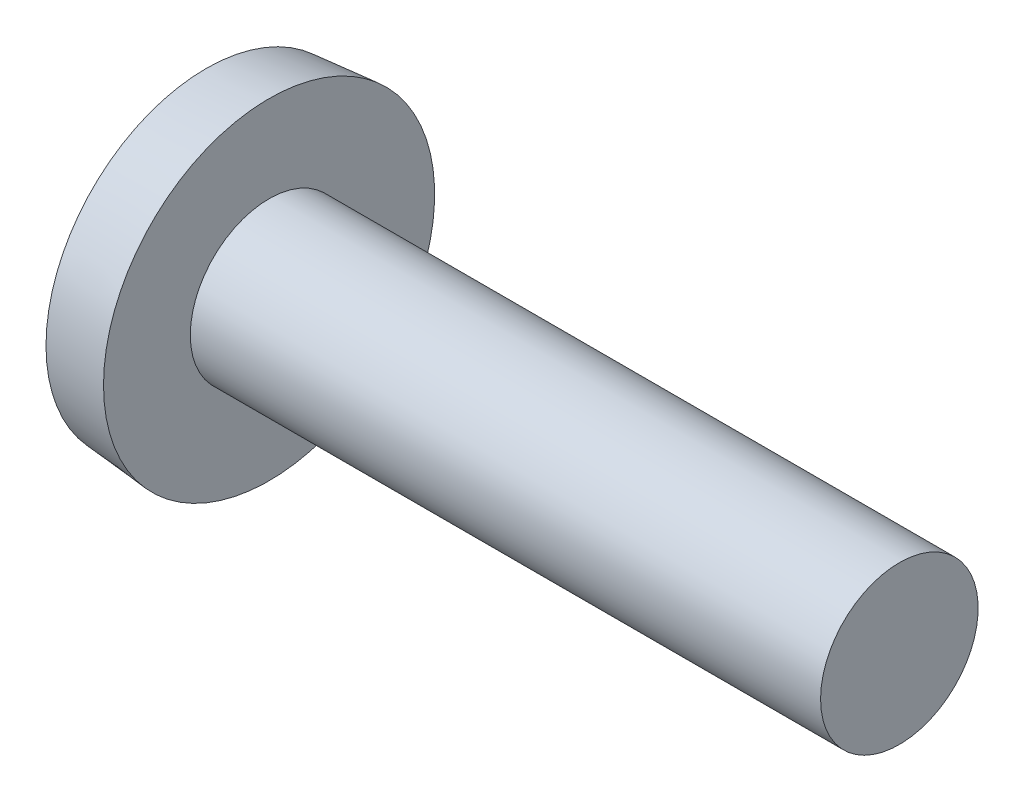
ISO-10303-21;
HEADER;
FILE_DESCRIPTION(('STEP AP214'),'2;1');
FILE_NAME('part.step','',(''),(''),'','','');
FILE_SCHEMA(('AUTOMOTIVE_DESIGN { 1 0 10303 214 1 1 1 1 }'));
ENDSEC;
DATA;
#1=APPLICATION_CONTEXT('core data for automotive mechanical design processes');
#2=APPLICATION_PROTOCOL_DEFINITION('international standard','automotive_design',2000,#1);
#3=PRODUCT_CONTEXT('',#1,'mechanical');
#4=PRODUCT('Part','Part','',(#3));
#5=PRODUCT_RELATED_PRODUCT_CATEGORY('part','',(#4));
#6=PRODUCT_DEFINITION_FORMATION('','',#4);
#7=PRODUCT_DEFINITION_CONTEXT('part definition',#1,'design');
#8=PRODUCT_DEFINITION('design','',#6,#7);
#9=PRODUCT_DEFINITION_SHAPE('','',#8);
#10=(LENGTH_UNIT() NAMED_UNIT(*) SI_UNIT(.MILLI.,.METRE.));
#11=(NAMED_UNIT(*) PLANE_ANGLE_UNIT() SI_UNIT($,.RADIAN.));
#12=(NAMED_UNIT(*) SI_UNIT($,.STERADIAN.) SOLID_ANGLE_UNIT());
#13=UNCERTAINTY_MEASURE_WITH_UNIT(LENGTH_MEASURE(1.E-05),#10,'distance_accuracy_value','');
#14=(GEOMETRIC_REPRESENTATION_CONTEXT(3) GLOBAL_UNCERTAINTY_ASSIGNED_CONTEXT((#13)) GLOBAL_UNIT_ASSIGNED_CONTEXT((#10,
#11,#12)) REPRESENTATION_CONTEXT('',''));
#15=CARTESIAN_POINT('',(0.,0.,0.));
#16=DIRECTION('',(0.,0.,1.));
#17=DIRECTION('',(1.,0.,0.));
#18=AXIS2_PLACEMENT_3D('',#15,#16,#17);
#19=CARTESIAN_POINT('',(20.7932858958974,0.,0.));
#20=DIRECTION('',(-1.,0.,0.));
#21=DIRECTION('',(0.,1.,0.));
#22=AXIS2_PLACEMENT_3D('',#19,#20,#21);
#23=SPHERICAL_SURFACE('',#22,20.7932858958974);
#24=CARTESIAN_POINT('',(10.7968001713112,0.,-7.77883530786916));
#25=DIRECTION('',(0.789207158591942,0.,0.61412707221489));
#26=DIRECTION('',(0.61412707221489,0.,-0.789207158591942));
#27=AXIS2_PLACEMENT_3D('',#24,#25,#26);
#28=CIRCLE('',#27,16.4900191861537);
#29=CARTESIAN_POINT('',(0.683324258951215,0.850899999999998,5.21786838652322));
#30=VERTEX_POINT('',#29);
#31=CARTESIAN_POINT('',(0.686560417440004,0.94739679267156,5.21370963899157));
#32=VERTEX_POINT('',#31);
#33=EDGE_CURVE('E381',#30,#32,#28,.F.);
#34=ORIENTED_EDGE('',*,*,#33,.F.);
#35=CARTESIAN_POINT('',(20.7932858958974,0.850899999999999,0.));
#36=DIRECTION('',(0.,-1.,0.));
#37=DIRECTION('',(0.,0.,-1.));
#38=AXIS2_PLACEMENT_3D('',#35,#36,#37);
#39=CIRCLE('',#38,20.7758683943301);
#40=CARTESIAN_POINT('',(2.2606,0.850899999999998,9.39022156408098));
#41=VERTEX_POINT('',#40);
#42=EDGE_CURVE('E274',#30,#41,#39,.F.);
#43=ORIENTED_EDGE('',*,*,#42,.T.);
#44=CARTESIAN_POINT('',(2.2606,0.,0.));
#45=DIRECTION('',(-1.,0.,0.));
#46=DIRECTION('',(0.,0.,1.));
#47=AXIS2_PLACEMENT_3D('',#44,#45,#46);
#48=CIRCLE('',#47,9.42869512883577);
#49=CARTESIAN_POINT('',(2.2606,-0.8509,9.39022156408098));
#50=VERTEX_POINT('',#49);
#51=EDGE_CURVE('E271',#41,#50,#48,.F.);
#52=ORIENTED_EDGE('',*,*,#51,.T.);
#53=CARTESIAN_POINT('',(20.7932858958974,-0.8509,0.));
#54=DIRECTION('',(0.,1.,0.));
#55=DIRECTION('',(0.,0.,1.));
#56=AXIS2_PLACEMENT_3D('',#53,#54,#55);
#57=CIRCLE('',#56,20.7758683943301);
#58=CARTESIAN_POINT('',(0.683324258951215,-0.8509,5.21786838652322));
#59=VERTEX_POINT('',#58);
#60=EDGE_CURVE('E280',#50,#59,#57,.F.);
#61=ORIENTED_EDGE('',*,*,#60,.T.);
#62=CARTESIAN_POINT('',(0.68656041744,-0.947396792671597,5.21370963899156));
#63=VERTEX_POINT('',#62);
#64=EDGE_CURVE('E384',#63,#59,#28,.F.);
#65=ORIENTED_EDGE('',*,*,#64,.F.);
#66=CARTESIAN_POINT('',(20.6258579707535,1.41383581232608,0.));
#67=DIRECTION('',(-0.117599343536163,0.993061123194269,0.));
#68=DIRECTION('',(-0.993061123194269,-0.117599343536163,0.));
#69=AXIS2_PLACEMENT_3D('',#66,#67,#68);
#70=CIRCLE('',#69,20.7444878108425);
#71=CARTESIAN_POINT('',(0.0503651349985992,-1.02273570769754,1.02273570769753));
#72=VERTEX_POINT('',#71);
#73=EDGE_CURVE('E367',#63,#72,#70,.F.);
#74=ORIENTED_EDGE('',*,*,#73,.T.);
#75=CARTESIAN_POINT('',(20.6258579707535,0.,-1.41383581232608));
#76=DIRECTION('',(-0.117599343536163,0.,-0.993061123194269));
#77=DIRECTION('',(-0.993061123194269,0.,0.117599343536163));
#78=AXIS2_PLACEMENT_3D('',#75,#76,#77);
#79=CIRCLE('',#78,20.7444878108425);
#80=CARTESIAN_POINT('',(0.686560417440005,-5.21370963899157,0.947396792671578));
#81=VERTEX_POINT('',#80);
#82=EDGE_CURVE('E242',#72,#81,#79,.F.);
#83=ORIENTED_EDGE('',*,*,#82,.T.);
#84=CARTESIAN_POINT('',(10.7968001713112,7.77883530786916,0.));
#85=DIRECTION('',(0.789207158591942,-0.61412707221489,0.));
#86=DIRECTION('',(0.61412707221489,0.789207158591942,0.));
#87=AXIS2_PLACEMENT_3D('',#84,#85,#86);
#88=CIRCLE('',#87,16.4900191861537);
#89=CARTESIAN_POINT('',(0.686560417440005,-5.21370963899157,-0.947396792671579));
#90=VERTEX_POINT('',#89);
#91=EDGE_CURVE('E290',#90,#81,#88,.F.);
#92=ORIENTED_EDGE('',*,*,#91,.F.);
#93=CARTESIAN_POINT('',(20.6258579707535,0.,1.41383581232608));
#94=DIRECTION('',(-0.117599343536164,0.,0.993061123194269));
#95=DIRECTION('',(0.993061123194269,0.,0.117599343536164));
#96=AXIS2_PLACEMENT_3D('',#93,#94,#95);
#97=CIRCLE('',#96,20.7444878108425);
#98=CARTESIAN_POINT('',(0.0503651349985992,-1.02273570769753,-1.02273570769753));
#99=VERTEX_POINT('',#98);
#100=EDGE_CURVE('E250',#90,#99,#97,.F.);
#101=ORIENTED_EDGE('',*,*,#100,.T.);
#102=CARTESIAN_POINT('',(0.686560417440005,-0.94739679267156,-5.21370963899158));
#103=VERTEX_POINT('',#102);
#104=EDGE_CURVE('E47',#99,#103,#70,.F.);
#105=ORIENTED_EDGE('',*,*,#104,.T.);
#106=CARTESIAN_POINT('',(10.7968001713112,0.,7.77883530786916));
#107=DIRECTION('',(0.789207158591942,0.,-0.61412707221489));
#108=DIRECTION('',(-0.61412707221489,0.,-0.789207158591942));
#109=AXIS2_PLACEMENT_3D('',#106,#107,#108);
#110=CIRCLE('',#109,16.4900191861537);
#111=CARTESIAN_POINT('',(0.683324258951215,-0.8509,-5.21786838652322));
#112=VERTEX_POINT('',#111);
#113=EDGE_CURVE('E357',#112,#103,#110,.F.);
#114=ORIENTED_EDGE('',*,*,#113,.F.);
#115=CARTESIAN_POINT('',(2.2606,-0.8509,-9.39022156408098));
#116=VERTEX_POINT('',#115);
#117=EDGE_CURVE('E279',#112,#116,#57,.F.);
#118=ORIENTED_EDGE('',*,*,#117,.T.);
#119=CARTESIAN_POINT('',(2.2606,0.8509,-9.39022156408098));
#120=VERTEX_POINT('',#119);
#121=EDGE_CURVE('E275',#116,#120,#48,.F.);
#122=ORIENTED_EDGE('',*,*,#121,.T.);
#123=CARTESIAN_POINT('',(0.683324258951217,0.850899999999999,-5.21786838652322));
#124=VERTEX_POINT('',#123);
#125=EDGE_CURVE('E276',#120,#124,#39,.F.);
#126=ORIENTED_EDGE('',*,*,#125,.T.);
#127=CARTESIAN_POINT('',(0.686560417440005,0.947396792671598,-5.21370963899157));
#128=VERTEX_POINT('',#127);
#129=EDGE_CURVE('E363',#128,#124,#110,.F.);
#130=ORIENTED_EDGE('',*,*,#129,.F.);
#131=CARTESIAN_POINT('',(20.6258579707535,-1.41383581232608,0.));
#132=DIRECTION('',(-0.117599343536164,-0.993061123194269,0.));
#133=DIRECTION('',(0.993061123194269,-0.117599343536164,0.));
#134=AXIS2_PLACEMENT_3D('',#131,#132,#133);
#135=CIRCLE('',#134,20.7444878108425);
#136=CARTESIAN_POINT('',(0.0503651349985958,1.02273570769754,-1.02273570769753));
#137=VERTEX_POINT('',#136);
#138=EDGE_CURVE('E228',#128,#137,#135,.F.);
#139=ORIENTED_EDGE('',*,*,#138,.T.);
#140=CARTESIAN_POINT('',(0.68656041744,5.21370963899157,-0.947396792671578));
#141=VERTEX_POINT('',#140);
#142=EDGE_CURVE('E248',#137,#141,#97,.F.);
#143=ORIENTED_EDGE('',*,*,#142,.T.);
#144=CARTESIAN_POINT('',(10.7968001713112,-7.77883530786916,0.));
#145=DIRECTION('',(0.789207158591942,0.61412707221489,0.));
#146=DIRECTION('',(-0.61412707221489,0.789207158591942,0.));
#147=AXIS2_PLACEMENT_3D('',#144,#145,#146);
#148=CIRCLE('',#147,16.4900191861537);
#149=CARTESIAN_POINT('',(0.686560417440004,5.21370963899156,0.947396792671578));
#150=VERTEX_POINT('',#149);
#151=EDGE_CURVE('E292',#150,#141,#148,.F.);
#152=ORIENTED_EDGE('',*,*,#151,.F.);
#153=CARTESIAN_POINT('',(0.0503651349986027,1.02273570769753,1.02273570769753));
#154=VERTEX_POINT('',#153);
#155=EDGE_CURVE('E208',#150,#154,#79,.F.);
#156=ORIENTED_EDGE('',*,*,#155,.T.);
#157=EDGE_CURVE('E232',#154,#32,#135,.F.);
#158=ORIENTED_EDGE('',*,*,#157,.T.);
#159=EDGE_LOOP('',(#34,#43,#52,#61,#65,#74,#83,#92,#101,#105,#114,#118,#122,#126,#130,#139,#143,
#152,#156,#158));
#160=FACE_BOUND('',#159,.T.);
#161=CARTESIAN_POINT('',(2.3876,0.,0.));
#162=DIRECTION('',(-1.,0.,0.));
#163=DIRECTION('',(0.,0.,1.));
#164=AXIS2_PLACEMENT_3D('',#161,#162,#163);
#165=CIRCLE('',#164,9.67426819196622);
#166=CARTESIAN_POINT('',(2.3876,0.,9.67426819196622));
#167=VERTEX_POINT('',#166);
#168=EDGE_CURVE('E265',#167,#167,#165,.T.);
#169=ORIENTED_EDGE('',*,*,#168,.T.);
#170=EDGE_LOOP('',(#169));
#171=FACE_BOUND('',#170,.T.);
#172=ADVANCED_FACE('F32',(#160,#171),#23,.T.);
#173=CARTESIAN_POINT('',(2.2606,-0.8509,10.0076));
#174=DIRECTION('',(0.,1.,0.));
#175=DIRECTION('',(0.,0.,1.));
#176=AXIS2_PLACEMENT_3D('',#173,#174,#175);
#177=PLANE('',#176);
#178=DIRECTION('',(-0.61412707221489,0.,-0.789207158591942));
#179=VECTOR('',#178,1.);
#180=CARTESIAN_POINT('',(8.65757782824143,-0.8509,5.02974694594183));
#181=LINE('',#180,#179);
#182=CARTESIAN_POINT('',(1.50142222222212,-0.850899999999999,-4.16654074074087));
#183=VERTEX_POINT('',#182);
#184=EDGE_CURVE('E361',#183,#112,#181,.T.);
#185=ORIENTED_EDGE('',*,*,#184,.F.);
#186=DIRECTION('',(0.,0.,1.));
#187=VECTOR('',#186,1.);
#188=CARTESIAN_POINT('',(1.50142222222252,-0.8509,10.0076));
#189=LINE('',#188,#187);
#190=CARTESIAN_POINT('',(1.50142222222221,-0.850899999999999,-0.850900000000001));
#191=VERTEX_POINT('',#190);
#192=EDGE_CURVE('E374',#183,#191,#189,.T.);
#193=ORIENTED_EDGE('',*,*,#192,.T.);
#194=DIRECTION('',(0.993061123194269,0.,0.117599343536164));
#195=VECTOR('',#194,1.);
#196=CARTESIAN_POINT('',(3.51819272665187,-0.8509,-0.61207191394912));
#197=LINE('',#196,#195);
#198=CARTESIAN_POINT('',(2.2606,-0.8509,-0.760997368421053));
#199=VERTEX_POINT('',#198);
#200=EDGE_CURVE('E246',#191,#199,#197,.T.);
#201=ORIENTED_EDGE('',*,*,#200,.T.);
#202=DIRECTION('',(0.,0.,-1.));
#203=VECTOR('',#202,1.);
#204=CARTESIAN_POINT('',(2.2606,-0.8509,10.0076));
#205=LINE('',#204,#203);
#206=EDGE_CURVE('E255',#199,#116,#205,.T.);
#207=ORIENTED_EDGE('',*,*,#206,.T.);
#208=ORIENTED_EDGE('',*,*,#117,.F.);
#209=EDGE_LOOP('',(#185,#193,#201,#207,#208));
#210=FACE_BOUND('',#209,.T.);
#211=ADVANCED_FACE('F432',(#210),#177,.T.);
#212=CARTESIAN_POINT('',(2.2606,0.8509,-10.0076));
#213=DIRECTION('',(0.,-1.,0.));
#214=DIRECTION('',(0.,0.,-1.));
#215=AXIS2_PLACEMENT_3D('',#212,#213,#214);
#216=PLANE('',#215);
#217=DIRECTION('',(-0.993061123194269,0.,-0.117599343536164));
#218=VECTOR('',#217,1.);
#219=CARTESIAN_POINT('',(1.18075089636332,0.850899999999999,-0.888874235956976));
#220=LINE('',#219,#218);
#221=CARTESIAN_POINT('',(2.2606,0.8509,-0.760997368421053));
#222=VERTEX_POINT('',#221);
#223=CARTESIAN_POINT('',(1.50142222222226,0.850899999999999,-0.850899999999996));
#224=VERTEX_POINT('',#223);
#225=EDGE_CURVE('E243',#222,#224,#220,.T.);
#226=ORIENTED_EDGE('',*,*,#225,.T.);
#227=DIRECTION('',(0.,0.,-1.));
#228=VECTOR('',#227,1.);
#229=CARTESIAN_POINT('',(1.50142222222253,0.8509,-10.0076));
#230=LINE('',#229,#228);
#231=CARTESIAN_POINT('',(1.50142222222237,0.850899999999999,-4.16654074074055));
#232=VERTEX_POINT('',#231);
#233=EDGE_CURVE('E55',#224,#232,#230,.T.);
#234=ORIENTED_EDGE('',*,*,#233,.T.);
#235=DIRECTION('',(0.61412707221489,0.,0.789207158591942));
#236=VECTOR('',#235,1.);
#237=CARTESIAN_POINT('',(-1.04325884222211,0.8509,-7.43667912618894));
#238=LINE('',#237,#236);
#239=EDGE_CURVE('E395',#124,#232,#238,.T.);
#240=ORIENTED_EDGE('',*,*,#239,.F.);
#241=ORIENTED_EDGE('',*,*,#125,.F.);
#242=DIRECTION('',(0.,0.,1.));
#243=VECTOR('',#242,1.);
#244=CARTESIAN_POINT('',(2.2606,0.8509,-10.0076));
#245=LINE('',#244,#243);
#246=EDGE_CURVE('E256',#120,#222,#245,.T.);
#247=ORIENTED_EDGE('',*,*,#246,.T.);
#248=EDGE_LOOP('',(#226,#234,#240,#241,#247));
#249=FACE_BOUND('',#248,.T.);
#250=ADVANCED_FACE('F394',(#249),#216,.T.);
#251=CARTESIAN_POINT('',(2.2606,-0.8509,10.0076));
#252=DIRECTION('',(-1.,0.,0.));
#253=DIRECTION('',(0.,0.,1.));
#254=AXIS2_PLACEMENT_3D('',#251,#252,#253);
#255=PLANE('',#254);
#256=DIRECTION('',(0.,-1.,0.));
#257=VECTOR('',#256,1.);
#258=CARTESIAN_POINT('',(2.2606,-0.850899999999953,-3.19093070175439));
#259=LINE('',#258,#257);
#260=CARTESIAN_POINT('',(2.2606,0.760997368421064,-3.19093070175438));
#261=VERTEX_POINT('',#260);
#262=CARTESIAN_POINT('',(2.2606,-0.760997368421041,-3.19093070175439));
#263=VERTEX_POINT('',#262);
#264=EDGE_CURVE('E326',#261,#263,#259,.T.);
#265=ORIENTED_EDGE('',*,*,#264,.F.);
#266=DIRECTION('',(0.,0.,1.));
#267=VECTOR('',#266,1.);
#268=CARTESIAN_POINT('',(2.2606,0.760997368421017,10.0076));
#269=LINE('',#268,#267);
#270=CARTESIAN_POINT('',(2.2606,0.760997368421055,-0.760997368421053));
#271=VERTEX_POINT('',#270);
#272=EDGE_CURVE('E389',#261,#271,#269,.T.);
#273=ORIENTED_EDGE('',*,*,#272,.T.);
#274=DIRECTION('',(0.,1.,0.));
#275=VECTOR('',#274,1.);
#276=CARTESIAN_POINT('',(2.2606,-0.850899999999999,-0.760997368421053));
#277=LINE('',#276,#275);
#278=EDGE_CURVE('E285',#271,#222,#277,.T.);
#279=ORIENTED_EDGE('',*,*,#278,.T.);
#280=ORIENTED_EDGE('',*,*,#246,.F.);
#281=ORIENTED_EDGE('',*,*,#121,.F.);
#282=ORIENTED_EDGE('',*,*,#206,.F.);
#283=CARTESIAN_POINT('',(2.2606,-0.76099736842105,-0.760997368421053));
#284=VERTEX_POINT('',#283);
#285=EDGE_CURVE('E287',#199,#284,#277,.T.);
#286=ORIENTED_EDGE('',*,*,#285,.T.);
#287=DIRECTION('',(0.,0.,-1.));
#288=VECTOR('',#287,1.);
#289=CARTESIAN_POINT('',(2.2606,-0.760997368421088,10.0076));
#290=LINE('',#289,#288);
#291=EDGE_CURVE('E334',#284,#263,#290,.T.);
#292=ORIENTED_EDGE('',*,*,#291,.T.);
#293=EDGE_LOOP('',(#265,#273,#279,#280,#281,#282,#286,#292));
#294=FACE_BOUND('',#293,.T.);
#295=ADVANCED_FACE('F397',(#294),#255,.T.);
#296=DIRECTION('',(0.,-1.,0.));
#297=VECTOR('',#296,1.);
#298=CARTESIAN_POINT('',(2.2606,-0.8509,0.760997368421052));
#299=LINE('',#298,#297);
#300=CARTESIAN_POINT('',(2.2606,0.8509,0.760997368421052));
#301=VERTEX_POINT('',#300);
#302=CARTESIAN_POINT('',(2.2606,0.76099736842105,0.760997368421052));
#303=VERTEX_POINT('',#302);
#304=EDGE_CURVE('E283',#301,#303,#299,.T.);
#305=ORIENTED_EDGE('',*,*,#304,.T.);
#306=DIRECTION('',(0.,0.,1.));
#307=VECTOR('',#306,1.);
#308=CARTESIAN_POINT('',(2.2606,0.760997368421017,10.0076));
#309=LINE('',#308,#307);
#310=CARTESIAN_POINT('',(2.2606,0.760997368421041,3.19093070175439));
#311=VERTEX_POINT('',#310);
#312=EDGE_CURVE('E186',#303,#311,#309,.T.);
#313=ORIENTED_EDGE('',*,*,#312,.T.);
#314=DIRECTION('',(0.,1.,0.));
#315=VECTOR('',#314,1.);
#316=CARTESIAN_POINT('',(2.2606,-0.850899999999976,3.19093070175438));
#317=LINE('',#316,#315);
#318=CARTESIAN_POINT('',(2.2606,-0.760997368421064,3.19093070175438));
#319=VERTEX_POINT('',#318);
#320=EDGE_CURVE('E198',#319,#311,#317,.T.);
#321=ORIENTED_EDGE('',*,*,#320,.F.);
#322=DIRECTION('',(0.,0.,-1.));
#323=VECTOR('',#322,1.);
#324=CARTESIAN_POINT('',(2.2606,-0.760997368421088,10.0076));
#325=LINE('',#324,#323);
#326=CARTESIAN_POINT('',(2.2606,-0.760997368421055,0.760997368421052));
#327=VERTEX_POINT('',#326);
#328=EDGE_CURVE('E356',#319,#327,#325,.T.);
#329=ORIENTED_EDGE('',*,*,#328,.T.);
#330=CARTESIAN_POINT('',(2.2606,-0.8509,0.760997368421052));
#331=VERTEX_POINT('',#330);
#332=EDGE_CURVE('E286',#327,#331,#299,.T.);
#333=ORIENTED_EDGE('',*,*,#332,.T.);
#334=EDGE_CURVE('E251',#50,#331,#205,.T.);
#335=ORIENTED_EDGE('',*,*,#334,.F.);
#336=ORIENTED_EDGE('',*,*,#51,.F.);
#337=EDGE_CURVE('E254',#301,#41,#245,.T.);
#338=ORIENTED_EDGE('',*,*,#337,.F.);
#339=EDGE_LOOP('',(#305,#313,#321,#329,#333,#335,#336,#338));
#340=FACE_BOUND('',#339,.T.);
#341=ADVANCED_FACE('F405',(#340),#255,.T.);
#342=CARTESIAN_POINT('',(4.74364505119454,0.,-0.466952559726962));
#343=DIRECTION('',(-0.117599343536164,0.,0.993061123194269));
#344=DIRECTION('',(0.993061123194269,0.,0.117599343536164));
#345=AXIS2_PLACEMENT_3D('',#342,#343,#344);
#346=PLANE('',#345);
#347=ORIENTED_EDGE('',*,*,#142,.F.);
#348=DIRECTION('',(0.986264714413907,-0.116794505654279,0.116794505654279));
#349=VECTOR('',#348,1.);
#350=CARTESIAN_POINT('',(4.79743345652516,0.460582880148338,-0.460582880148336));
#351=LINE('',#350,#349);
#352=EDGE_CURVE('E305',#137,#224,#351,.T.);
#353=ORIENTED_EDGE('',*,*,#352,.T.);
#354=ORIENTED_EDGE('',*,*,#225,.F.);
#355=ORIENTED_EDGE('',*,*,#278,.F.);
#356=CARTESIAN_POINT('',(4.3434,0.514350000000002,-0.514349999999998));
#357=VERTEX_POINT('',#356);
#358=EDGE_CURVE('E308',#271,#357,#351,.T.);
#359=ORIENTED_EDGE('',*,*,#358,.T.);
#360=DIRECTION('',(0.612509424353723,-0.787128339191407,0.0725340107787303));
#361=VECTOR('',#360,1.);
#362=CARTESIAN_POINT('',(0.,6.096,-1.0287));
#363=LINE('',#362,#361);
#364=EDGE_CURVE('E212',#141,#357,#363,.T.);
#365=ORIENTED_EDGE('',*,*,#364,.F.);
#366=EDGE_LOOP('',(#347,#353,#354,#355,#359,#365));
#367=FACE_BOUND('',#366,.T.);
#368=ADVANCED_FACE('F303',(#367),#346,.T.);
#369=DIRECTION('',(0.612509424353723,0.787128339191407,0.0725340107787305));
#370=VECTOR('',#369,1.);
#371=CARTESIAN_POINT('',(0.,-6.096,-1.0287));
#372=LINE('',#371,#370);
#373=CARTESIAN_POINT('',(4.3434,-0.51435,-0.51435));
#374=VERTEX_POINT('',#373);
#375=EDGE_CURVE('E213',#90,#374,#372,.T.);
#376=ORIENTED_EDGE('',*,*,#375,.T.);
#377=DIRECTION('',(-0.986264714413907,-0.116794505654278,-0.116794505654279));
#378=VECTOR('',#377,1.);
#379=CARTESIAN_POINT('',(4.79743345652516,-0.460582880148334,-0.460582880148336));
#380=LINE('',#379,#378);
#381=EDGE_CURVE('E332',#374,#284,#380,.T.);
#382=ORIENTED_EDGE('',*,*,#381,.T.);
#383=ORIENTED_EDGE('',*,*,#285,.F.);
#384=ORIENTED_EDGE('',*,*,#200,.F.);
#385=EDGE_CURVE('E338',#191,#99,#380,.T.);
#386=ORIENTED_EDGE('',*,*,#385,.T.);
#387=ORIENTED_EDGE('',*,*,#100,.F.);
#388=EDGE_LOOP('',(#376,#382,#383,#384,#386,#387));
#389=FACE_BOUND('',#388,.T.);
#390=ADVANCED_FACE('F340',(#389),#346,.T.);
#391=CARTESIAN_POINT('',(4.74364505119454,0.,0.466952559726962));
#392=DIRECTION('',(-0.117599343536163,0.,-0.993061123194269));
#393=DIRECTION('',(-0.993061123194269,0.,0.117599343536163));
#394=AXIS2_PLACEMENT_3D('',#391,#392,#393);
#395=PLANE('',#394);
#396=DIRECTION('',(0.612509424353723,-0.787128339191407,-0.0725340107787303));
#397=VECTOR('',#396,1.);
#398=CARTESIAN_POINT('',(0.,6.096,1.0287));
#399=LINE('',#398,#397);
#400=CARTESIAN_POINT('',(4.3434,0.514349999999998,0.514350000000002));
#401=VERTEX_POINT('',#400);
#402=EDGE_CURVE('E203',#150,#401,#399,.T.);
#403=ORIENTED_EDGE('',*,*,#402,.T.);
#404=DIRECTION('',(-0.986264714413907,0.116794505654278,0.116794505654278));
#405=VECTOR('',#404,1.);
#406=CARTESIAN_POINT('',(4.79743345652516,0.460582880148334,0.460582880148336));
#407=LINE('',#406,#405);
#408=EDGE_CURVE('E11',#401,#303,#407,.T.);
#409=ORIENTED_EDGE('',*,*,#408,.T.);
#410=ORIENTED_EDGE('',*,*,#304,.F.);
#411=DIRECTION('',(0.993061123194269,0.,-0.117599343536163));
#412=VECTOR('',#411,1.);
#413=CARTESIAN_POINT('',(3.51819272665187,0.850899999999999,0.612071913949118));
#414=LINE('',#413,#412);
#415=CARTESIAN_POINT('',(1.50142222222222,0.850899999999998,0.850899999999999));
#416=VERTEX_POINT('',#415);
#417=EDGE_CURVE('E236',#416,#301,#414,.T.);
#418=ORIENTED_EDGE('',*,*,#417,.F.);
#419=EDGE_CURVE('E36',#416,#154,#407,.T.);
#420=ORIENTED_EDGE('',*,*,#419,.T.);
#421=ORIENTED_EDGE('',*,*,#155,.F.);
#422=EDGE_LOOP('',(#403,#409,#410,#418,#420,#421));
#423=FACE_BOUND('',#422,.T.);
#424=ADVANCED_FACE('F205',(#423),#395,.T.);
#425=ORIENTED_EDGE('',*,*,#82,.F.);
#426=DIRECTION('',(0.986264714413907,0.116794505654279,-0.116794505654278));
#427=VECTOR('',#426,1.);
#428=CARTESIAN_POINT('',(4.79743345652516,-0.460582880148338,0.460582880148336));
#429=LINE('',#428,#427);
#430=CARTESIAN_POINT('',(1.5014222222222,-0.850900000000003,0.850900000000002));
#431=VERTEX_POINT('',#430);
#432=EDGE_CURVE('E359',#72,#431,#429,.T.);
#433=ORIENTED_EDGE('',*,*,#432,.T.);
#434=DIRECTION('',(-0.993061123194269,0.,0.117599343536163));
#435=VECTOR('',#434,1.);
#436=CARTESIAN_POINT('',(1.18075089636333,-0.8509,0.888874235956974));
#437=LINE('',#436,#435);
#438=EDGE_CURVE('E238',#331,#431,#437,.T.);
#439=ORIENTED_EDGE('',*,*,#438,.F.);
#440=ORIENTED_EDGE('',*,*,#332,.F.);
#441=CARTESIAN_POINT('',(4.3434,-0.51435,0.51435));
#442=VERTEX_POINT('',#441);
#443=EDGE_CURVE('E352',#327,#442,#429,.T.);
#444=ORIENTED_EDGE('',*,*,#443,.T.);
#445=DIRECTION('',(0.612509424353723,0.787128339191407,-0.0725340107787303));
#446=VECTOR('',#445,1.);
#447=CARTESIAN_POINT('',(0.,-6.096,1.0287));
#448=LINE('',#447,#446);
#449=EDGE_CURVE('E315',#81,#442,#448,.T.);
#450=ORIENTED_EDGE('',*,*,#449,.F.);
#451=EDGE_LOOP('',(#425,#433,#439,#440,#444,#450));
#452=FACE_BOUND('',#451,.T.);
#453=ADVANCED_FACE('F349',(#452),#395,.T.);
#454=DIRECTION('',(0.61412707221489,0.,-0.789207158591942));
#455=VECTOR('',#454,1.);
#456=CARTESIAN_POINT('',(-1.04325884222211,-0.8509,7.43667912618894));
#457=LINE('',#456,#455);
#458=CARTESIAN_POINT('',(1.50142222222234,-0.8509,4.16654074074058));
#459=VERTEX_POINT('',#458);
#460=EDGE_CURVE('E383',#59,#459,#457,.T.);
#461=ORIENTED_EDGE('',*,*,#460,.F.);
#462=ORIENTED_EDGE('',*,*,#60,.F.);
#463=ORIENTED_EDGE('',*,*,#334,.T.);
#464=ORIENTED_EDGE('',*,*,#438,.T.);
#465=DIRECTION('',(0.,0.,1.));
#466=VECTOR('',#465,1.);
#467=CARTESIAN_POINT('',(1.50142222222252,-0.8509,10.0076));
#468=LINE('',#467,#466);
#469=EDGE_CURVE('E365',#431,#459,#468,.T.);
#470=ORIENTED_EDGE('',*,*,#469,.T.);
#471=EDGE_LOOP('',(#461,#462,#463,#464,#470));
#472=FACE_BOUND('',#471,.T.);
#473=ADVANCED_FACE('F408',(#472),#177,.T.);
#474=DIRECTION('',(-0.61412707221489,0.,0.789207158591942));
#475=VECTOR('',#474,1.);
#476=CARTESIAN_POINT('',(8.65757782824142,0.850899999999999,-5.02974694594183));
#477=LINE('',#476,#475);
#478=CARTESIAN_POINT('',(1.50142222222211,0.850899999999998,4.16654074074088));
#479=VERTEX_POINT('',#478);
#480=EDGE_CURVE('E379',#479,#30,#477,.T.);
#481=ORIENTED_EDGE('',*,*,#480,.F.);
#482=DIRECTION('',(0.,0.,-1.));
#483=VECTOR('',#482,1.);
#484=CARTESIAN_POINT('',(1.50142222222253,0.8509,-10.0076));
#485=LINE('',#484,#483);
#486=EDGE_CURVE('E386',#479,#416,#485,.T.);
#487=ORIENTED_EDGE('',*,*,#486,.T.);
#488=ORIENTED_EDGE('',*,*,#417,.T.);
#489=ORIENTED_EDGE('',*,*,#337,.T.);
#490=ORIENTED_EDGE('',*,*,#42,.F.);
#491=EDGE_LOOP('',(#481,#487,#488,#489,#490));
#492=FACE_BOUND('',#491,.T.);
#493=ADVANCED_FACE('F415',(#492),#216,.T.);
#494=CARTESIAN_POINT('',(-25.4,0.,0.));
#495=DIRECTION('',(-1.,0.,0.));
#496=DIRECTION('',(0.,0.,1.));
#497=AXIS2_PLACEMENT_3D('',#494,#495,#496);
#498=CYLINDRICAL_SURFACE('',#497,4.7625);
#499=CARTESIAN_POINT('',(44.2976,0.,0.));
#500=DIRECTION('',(-1.,0.,0.));
#501=DIRECTION('',(0.,0.,1.));
#502=AXIS2_PLACEMENT_3D('',#499,#500,#501);
#503=CIRCLE('',#502,4.7625);
#504=CARTESIAN_POINT('',(44.2976,0.,4.7625));
#505=VERTEX_POINT('',#504);
#506=EDGE_CURVE('E268',#505,#505,#503,.T.);
#507=ORIENTED_EDGE('',*,*,#506,.T.);
#508=EDGE_LOOP('',(#507));
#509=FACE_BOUND('',#508,.T.);
#510=CARTESIAN_POINT('',(6.1976,0.,0.));
#511=DIRECTION('',(-1.,0.,0.));
#512=DIRECTION('',(0.,0.,1.));
#513=AXIS2_PLACEMENT_3D('',#510,#511,#512);
#514=CIRCLE('',#513,4.7625);
#515=CARTESIAN_POINT('',(6.1976,0.,4.7625));
#516=VERTEX_POINT('',#515);
#517=EDGE_CURVE('E259',#516,#516,#514,.T.);
#518=ORIENTED_EDGE('',*,*,#517,.F.);
#519=EDGE_LOOP('',(#518));
#520=FACE_BOUND('',#519,.T.);
#521=ADVANCED_FACE('F34',(#509,#520),#498,.T.);
#522=CARTESIAN_POINT('',(44.2976,4.7625,0.));
#523=DIRECTION('',(1.,0.,0.));
#524=DIRECTION('',(0.,0.,-1.));
#525=AXIS2_PLACEMENT_3D('',#522,#523,#524);
#526=PLANE('',#525);
#527=ORIENTED_EDGE('',*,*,#506,.F.);
#528=EDGE_LOOP('',(#527));
#529=FACE_BOUND('',#528,.T.);
#530=ADVANCED_FACE('F462',(#529),#526,.T.);
#531=CARTESIAN_POINT('',(6.1976,0.,0.));
#532=DIRECTION('',(1.,0.,0.));
#533=DIRECTION('',(0.,0.,-1.));
#534=AXIS2_PLACEMENT_3D('',#531,#532,#533);
#535=CONICAL_SURFACE('',#534,10.0076,0.0872664625997203);
#536=ORIENTED_EDGE('',*,*,#168,.F.);
#537=EDGE_LOOP('',(#536));
#538=FACE_BOUND('',#537,.T.);
#539=CARTESIAN_POINT('',(6.1976,0.,0.));
#540=DIRECTION('',(-1.,0.,0.));
#541=DIRECTION('',(0.,0.,1.));
#542=AXIS2_PLACEMENT_3D('',#539,#540,#541);
#543=CIRCLE('',#542,10.0076);
#544=CARTESIAN_POINT('',(6.1976,0.,10.0076));
#545=VERTEX_POINT('',#544);
#546=EDGE_CURVE('E262',#545,#545,#543,.T.);
#547=ORIENTED_EDGE('',*,*,#546,.T.);
#548=EDGE_LOOP('',(#547));
#549=FACE_BOUND('',#548,.T.);
#550=ADVANCED_FACE('F460',(#538,#549),#535,.T.);
#551=CARTESIAN_POINT('',(6.1976,4.7625,0.));
#552=DIRECTION('',(-1.,0.,0.));
#553=DIRECTION('',(0.,0.,1.));
#554=AXIS2_PLACEMENT_3D('',#551,#552,#553);
#555=PLANE('',#554);
#556=ORIENTED_EDGE('',*,*,#546,.F.);
#557=EDGE_LOOP('',(#556));
#558=FACE_BOUND('',#557,.T.);
#559=ORIENTED_EDGE('',*,*,#517,.T.);
#560=EDGE_LOOP('',(#559));
#561=FACE_BOUND('',#560,.T.);
#562=ADVANCED_FACE('F469',(#558,#561),#555,.F.);
#563=CARTESIAN_POINT('',(4.3434,0.51435,0.51435));
#564=DIRECTION('',(-1.,0.,0.));
#565=DIRECTION('',(0.,0.,1.));
#566=AXIS2_PLACEMENT_3D('',#563,#564,#565);
#567=PLANE('',#566);
#568=DIRECTION('',(0.,1.,0.));
#569=VECTOR('',#568,1.);
#570=CARTESIAN_POINT('',(4.3434,-0.51435,0.51435));
#571=LINE('',#570,#569);
#572=EDGE_CURVE('E195',#442,#401,#571,.T.);
#573=ORIENTED_EDGE('',*,*,#572,.T.);
#574=DIRECTION('',(0.,0.,-1.));
#575=VECTOR('',#574,1.);
#576=CARTESIAN_POINT('',(4.3434,0.51435,0.51435));
#577=LINE('',#576,#575);
#578=EDGE_CURVE('E217',#401,#357,#577,.T.);
#579=ORIENTED_EDGE('',*,*,#578,.T.);
#580=DIRECTION('',(0.,-1.,0.));
#581=VECTOR('',#580,1.);
#582=CARTESIAN_POINT('',(4.3434,0.51435,-0.51435));
#583=LINE('',#582,#581);
#584=EDGE_CURVE('E222',#357,#374,#583,.T.);
#585=ORIENTED_EDGE('',*,*,#584,.T.);
#586=DIRECTION('',(0.,0.,1.));
#587=VECTOR('',#586,1.);
#588=CARTESIAN_POINT('',(4.3434,-0.51435,-0.51435));
#589=LINE('',#588,#587);
#590=EDGE_CURVE('E227',#374,#442,#589,.T.);
#591=ORIENTED_EDGE('',*,*,#590,.T.);
#592=EDGE_LOOP('',(#573,#579,#585,#591));
#593=FACE_BOUND('',#592,.T.);
#594=ADVANCED_FACE('F225',(#593),#567,.T.);
#595=CARTESIAN_POINT('',(4.3434,0.51435,0.51435));
#596=DIRECTION('',(0.789207158591942,0.61412707221489,0.));
#597=DIRECTION('',(-0.61412707221489,0.789207158591942,0.));
#598=AXIS2_PLACEMENT_3D('',#595,#596,#597);
#599=PLANE('',#598);
#600=ORIENTED_EDGE('',*,*,#151,.T.);
#601=ORIENTED_EDGE('',*,*,#364,.T.);
#602=ORIENTED_EDGE('',*,*,#578,.F.);
#603=ORIENTED_EDGE('',*,*,#402,.F.);
#604=EDGE_LOOP('',(#600,#601,#602,#603));
#605=FACE_BOUND('',#604,.T.);
#606=ADVANCED_FACE('F218',(#605),#599,.F.);
#607=CARTESIAN_POINT('',(4.3434,-0.51435,-0.51435));
#608=DIRECTION('',(0.789207158591942,-0.61412707221489,0.));
#609=DIRECTION('',(0.61412707221489,0.789207158591942,0.));
#610=AXIS2_PLACEMENT_3D('',#607,#608,#609);
#611=PLANE('',#610);
#612=ORIENTED_EDGE('',*,*,#91,.T.);
#613=ORIENTED_EDGE('',*,*,#449,.T.);
#614=ORIENTED_EDGE('',*,*,#590,.F.);
#615=ORIENTED_EDGE('',*,*,#375,.F.);
#616=EDGE_LOOP('',(#612,#613,#614,#615));
#617=FACE_BOUND('',#616,.T.);
#618=ADVANCED_FACE('F344',(#617),#611,.F.);
#619=CARTESIAN_POINT('',(4.74364505119454,0.466952559726962,0.));
#620=DIRECTION('',(-0.117599343536164,-0.993061123194269,0.));
#621=DIRECTION('',(0.993061123194269,-0.117599343536164,0.));
#622=AXIS2_PLACEMENT_3D('',#619,#620,#621);
#623=PLANE('',#622);
#624=ORIENTED_EDGE('',*,*,#408,.F.);
#625=DIRECTION('',(0.612509424353723,-0.0725340107787276,-0.787128339191407));
#626=VECTOR('',#625,1.);
#627=CARTESIAN_POINT('',(0.,1.02869999999998,6.096));
#628=LINE('',#627,#626);
#629=EDGE_CURVE('E184',#311,#401,#628,.T.);
#630=ORIENTED_EDGE('',*,*,#629,.F.);
#631=ORIENTED_EDGE('',*,*,#312,.F.);
#632=EDGE_LOOP('',(#624,#630,#631));
#633=FACE_BOUND('',#632,.T.);
#634=ADVANCED_FACE('F183',(#633),#623,.T.);
#635=CARTESIAN_POINT('',(4.74364505119454,-0.466952559726962,0.));
#636=DIRECTION('',(-0.117599343536163,0.993061123194269,0.));
#637=DIRECTION('',(-0.993061123194269,-0.117599343536163,0.));
#638=AXIS2_PLACEMENT_3D('',#635,#636,#637);
#639=PLANE('',#638);
#640=DIRECTION('',(0.612509424353723,0.0725340107787331,-0.787128339191407));
#641=VECTOR('',#640,1.);
#642=CARTESIAN_POINT('',(0.,-1.02870000000002,6.096));
#643=LINE('',#642,#641);
#644=EDGE_CURVE('E423',#319,#442,#643,.T.);
#645=ORIENTED_EDGE('',*,*,#644,.T.);
#646=ORIENTED_EDGE('',*,*,#443,.F.);
#647=ORIENTED_EDGE('',*,*,#328,.F.);
#648=EDGE_LOOP('',(#645,#646,#647));
#649=FACE_BOUND('',#648,.T.);
#650=ADVANCED_FACE('F449',(#649),#639,.T.);
#651=CARTESIAN_POINT('',(4.3434,-0.514350000000002,0.514349999999998));
#652=DIRECTION('',(0.789207158591942,0.,0.61412707221489));
#653=DIRECTION('',(-0.61412707221489,0.,0.789207158591942));
#654=AXIS2_PLACEMENT_3D('',#651,#652,#653);
#655=PLANE('',#654);
#656=ORIENTED_EDGE('',*,*,#320,.T.);
#657=ORIENTED_EDGE('',*,*,#629,.T.);
#658=ORIENTED_EDGE('',*,*,#572,.F.);
#659=ORIENTED_EDGE('',*,*,#644,.F.);
#660=EDGE_LOOP('',(#656,#657,#658,#659));
#661=FACE_BOUND('',#660,.T.);
#662=ADVANCED_FACE('F192',(#661),#655,.F.);
#663=EDGE_CURVE('E200',#63,#459,#643,.T.);
#664=ORIENTED_EDGE('',*,*,#663,.T.);
#665=ORIENTED_EDGE('',*,*,#469,.F.);
#666=ORIENTED_EDGE('',*,*,#432,.F.);
#667=ORIENTED_EDGE('',*,*,#73,.F.);
#668=EDGE_LOOP('',(#664,#665,#666,#667));
#669=FACE_BOUND('',#668,.T.);
#670=ADVANCED_FACE('F437',(#669),#639,.T.);
#671=ORIENTED_EDGE('',*,*,#64,.T.);
#672=ORIENTED_EDGE('',*,*,#460,.T.);
#673=ORIENTED_EDGE('',*,*,#663,.F.);
#674=EDGE_LOOP('',(#671,#672,#673));
#675=FACE_BOUND('',#674,.T.);
#676=ADVANCED_FACE('F439',(#675),#655,.F.);
#677=ORIENTED_EDGE('',*,*,#419,.F.);
#678=ORIENTED_EDGE('',*,*,#486,.F.);
#679=EDGE_CURVE('E199',#32,#479,#628,.T.);
#680=ORIENTED_EDGE('',*,*,#679,.F.);
#681=ORIENTED_EDGE('',*,*,#157,.F.);
#682=EDGE_LOOP('',(#677,#678,#680,#681));
#683=FACE_BOUND('',#682,.T.);
#684=ADVANCED_FACE('F418',(#683),#623,.T.);
#685=ORIENTED_EDGE('',*,*,#33,.T.);
#686=ORIENTED_EDGE('',*,*,#679,.T.);
#687=ORIENTED_EDGE('',*,*,#480,.T.);
#688=EDGE_LOOP('',(#685,#686,#687));
#689=FACE_BOUND('',#688,.T.);
#690=ADVANCED_FACE('F420',(#689),#655,.F.);
#691=CARTESIAN_POINT('',(4.3434,0.514350000000002,-0.514349999999998));
#692=DIRECTION('',(0.789207158591942,0.,-0.61412707221489));
#693=DIRECTION('',(0.61412707221489,0.,0.789207158591942));
#694=AXIS2_PLACEMENT_3D('',#691,#692,#693);
#695=PLANE('',#694);
#696=ORIENTED_EDGE('',*,*,#264,.T.);
#697=DIRECTION('',(0.612509424353723,0.0725340107787276,0.787128339191407));
#698=VECTOR('',#697,1.);
#699=CARTESIAN_POINT('',(0.,-1.02869999999998,-6.096));
#700=LINE('',#699,#698);
#701=EDGE_CURVE('E324',#263,#374,#700,.T.);
#702=ORIENTED_EDGE('',*,*,#701,.T.);
#703=ORIENTED_EDGE('',*,*,#584,.F.);
#704=DIRECTION('',(0.612509424353723,-0.0725340107787332,0.787128339191407));
#705=VECTOR('',#704,1.);
#706=CARTESIAN_POINT('',(0.,1.02870000000002,-6.096));
#707=LINE('',#706,#705);
#708=EDGE_CURVE('E321',#261,#357,#707,.T.);
#709=ORIENTED_EDGE('',*,*,#708,.F.);
#710=EDGE_LOOP('',(#696,#702,#703,#709));
#711=FACE_BOUND('',#710,.T.);
#712=ADVANCED_FACE('F320',(#711),#695,.F.);
#713=ORIENTED_EDGE('',*,*,#381,.F.);
#714=ORIENTED_EDGE('',*,*,#701,.F.);
#715=ORIENTED_EDGE('',*,*,#291,.F.);
#716=EDGE_LOOP('',(#713,#714,#715));
#717=FACE_BOUND('',#716,.T.);
#718=ADVANCED_FACE('F333',(#717),#639,.T.);
#719=ORIENTED_EDGE('',*,*,#708,.T.);
#720=ORIENTED_EDGE('',*,*,#358,.F.);
#721=ORIENTED_EDGE('',*,*,#272,.F.);
#722=EDGE_LOOP('',(#719,#720,#721));
#723=FACE_BOUND('',#722,.T.);
#724=ADVANCED_FACE('F502',(#723),#623,.T.);
#725=ORIENTED_EDGE('',*,*,#385,.F.);
#726=ORIENTED_EDGE('',*,*,#192,.F.);
#727=EDGE_CURVE('E329',#103,#183,#700,.T.);
#728=ORIENTED_EDGE('',*,*,#727,.F.);
#729=ORIENTED_EDGE('',*,*,#104,.F.);
#730=EDGE_LOOP('',(#725,#726,#728,#729));
#731=FACE_BOUND('',#730,.T.);
#732=ADVANCED_FACE('F450',(#731),#639,.T.);
#733=ORIENTED_EDGE('',*,*,#113,.T.);
#734=ORIENTED_EDGE('',*,*,#727,.T.);
#735=ORIENTED_EDGE('',*,*,#184,.T.);
#736=EDGE_LOOP('',(#733,#734,#735));
#737=FACE_BOUND('',#736,.T.);
#738=ADVANCED_FACE('F430',(#737),#695,.F.);
#739=EDGE_CURVE('E425',#128,#232,#707,.T.);
#740=ORIENTED_EDGE('',*,*,#739,.T.);
#741=ORIENTED_EDGE('',*,*,#233,.F.);
#742=ORIENTED_EDGE('',*,*,#352,.F.);
#743=ORIENTED_EDGE('',*,*,#138,.F.);
#744=EDGE_LOOP('',(#740,#741,#742,#743));
#745=FACE_BOUND('',#744,.T.);
#746=ADVANCED_FACE('F447',(#745),#623,.T.);
#747=ORIENTED_EDGE('',*,*,#129,.T.);
#748=ORIENTED_EDGE('',*,*,#239,.T.);
#749=ORIENTED_EDGE('',*,*,#739,.F.);
#750=EDGE_LOOP('',(#747,#748,#749));
#751=FACE_BOUND('',#750,.T.);
#752=ADVANCED_FACE('F497',(#751),#695,.F.);
#753=CLOSED_SHELL('',(#172,#211,#250,#295,#341,#368,#390,#424,#453,#473,#493,#521,#530,#550,
#562,#594,#606,#618,#634,#650,#662,#670,#676,#684,#690,#712,#718,#724,#732,#738,#746,#752));
#754=MANIFOLD_SOLID_BREP('B2',#753);
#755=ADVANCED_BREP_SHAPE_REPRESENTATION('',(#18,#754),#14);
#756=SHAPE_DEFINITION_REPRESENTATION(#9,#755);
ENDSEC;
END-ISO-10303-21;
